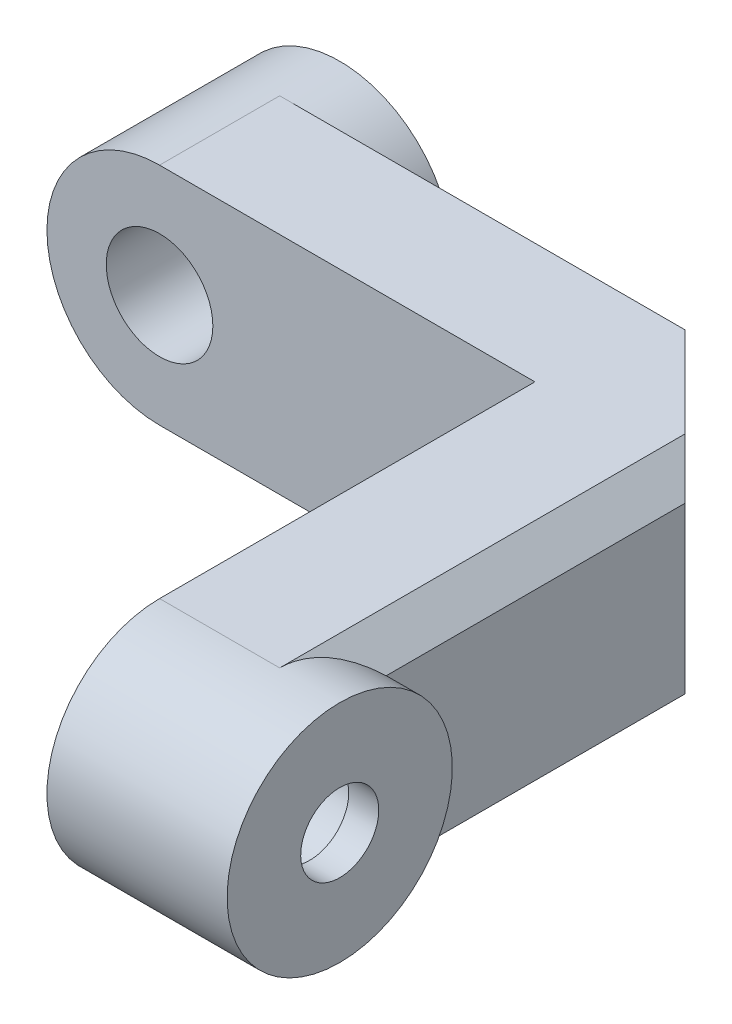
ISO-10303-21;
HEADER;
FILE_DESCRIPTION(('STEP AP214'),'2;1');
FILE_NAME('part.step','',(''),(''),'','','');
FILE_SCHEMA(('AUTOMOTIVE_DESIGN { 1 0 10303 214 1 1 1 1 }'));
ENDSEC;
DATA;
#1=APPLICATION_CONTEXT('core data for automotive mechanical design processes');
#2=APPLICATION_PROTOCOL_DEFINITION('international standard','automotive_design',2000,#1);
#3=PRODUCT_CONTEXT('',#1,'mechanical');
#4=PRODUCT('Part','Part','',(#3));
#5=PRODUCT_RELATED_PRODUCT_CATEGORY('part','',(#4));
#6=PRODUCT_DEFINITION_FORMATION('','',#4);
#7=PRODUCT_DEFINITION_CONTEXT('part definition',#1,'design');
#8=PRODUCT_DEFINITION('design','',#6,#7);
#9=PRODUCT_DEFINITION_SHAPE('','',#8);
#10=(LENGTH_UNIT() NAMED_UNIT(*) SI_UNIT(.MILLI.,.METRE.));
#11=(NAMED_UNIT(*) PLANE_ANGLE_UNIT() SI_UNIT($,.RADIAN.));
#12=(NAMED_UNIT(*) SI_UNIT($,.STERADIAN.) SOLID_ANGLE_UNIT());
#13=UNCERTAINTY_MEASURE_WITH_UNIT(LENGTH_MEASURE(1.E-05),#10,'distance_accuracy_value','');
#14=(GEOMETRIC_REPRESENTATION_CONTEXT(3) GLOBAL_UNCERTAINTY_ASSIGNED_CONTEXT((#13)) GLOBAL_UNIT_ASSIGNED_CONTEXT((#10,
#11,#12)) REPRESENTATION_CONTEXT('',''));
#15=CARTESIAN_POINT('',(0.,0.,0.));
#16=DIRECTION('',(0.,0.,1.));
#17=DIRECTION('',(1.,0.,0.));
#18=AXIS2_PLACEMENT_3D('',#15,#16,#17);
#19=CARTESIAN_POINT('',(0.,0.,0.));
#20=DIRECTION('',(0.,0.,1.));
#21=DIRECTION('',(1.,0.,0.));
#22=AXIS2_PLACEMENT_3D('',#19,#20,#21);
#23=PLANE('',#22);
#24=DIRECTION('',(0.,-1.,0.));
#25=VECTOR('',#24,1.);
#26=CARTESIAN_POINT('',(25.,0.,0.));
#27=LINE('',#26,#25);
#28=CARTESIAN_POINT('',(25.,5.5,0.));
#29=VERTEX_POINT('',#28);
#30=CARTESIAN_POINT('',(25.,-5.5,0.));
#31=VERTEX_POINT('',#30);
#32=EDGE_CURVE('E205',#29,#31,#27,.T.);
#33=ORIENTED_EDGE('',*,*,#32,.T.);
#34=DIRECTION('',(-1.,0.,0.));
#35=VECTOR('',#34,1.);
#36=CARTESIAN_POINT('',(0.,-5.5,0.));
#37=LINE('',#36,#35);
#38=CARTESIAN_POINT('',(5.09901951359279,-5.5,0.));
#39=VERTEX_POINT('',#38);
#40=EDGE_CURVE('E59',#31,#39,#37,.T.);
#41=ORIENTED_EDGE('',*,*,#40,.T.);
#42=CARTESIAN_POINT('',(0.,0.,0.));
#43=DIRECTION('',(0.,0.,-1.));
#44=DIRECTION('',(-1.,0.,0.));
#45=AXIS2_PLACEMENT_3D('',#42,#43,#44);
#46=CIRCLE('',#45,7.5);
#47=CARTESIAN_POINT('',(5.09901951359279,5.5,0.));
#48=VERTEX_POINT('',#47);
#49=EDGE_CURVE('E259',#48,#39,#46,.T.);
#50=ORIENTED_EDGE('',*,*,#49,.F.);
#51=DIRECTION('',(1.,0.,0.));
#52=VECTOR('',#51,1.);
#53=CARTESIAN_POINT('',(25.,5.5,0.));
#54=LINE('',#53,#52);
#55=EDGE_CURVE('E245',#48,#29,#54,.T.);
#56=ORIENTED_EDGE('',*,*,#55,.T.);
#57=EDGE_LOOP('',(#33,#41,#50,#56));
#58=FACE_BOUND('',#57,.T.);
#59=ADVANCED_FACE('F42',(#58),#23,.F.);
#60=CARTESIAN_POINT('',(35.,-7.5,50.));
#61=DIRECTION('',(0.,-1.,0.));
#62=DIRECTION('',(1.,0.,0.));
#63=AXIS2_PLACEMENT_3D('',#60,#61,#62);
#64=PLANE('',#63);
#65=DIRECTION('',(-0.707106781186548,0.,-0.707106781186547));
#66=VECTOR('',#65,1.);
#67=CARTESIAN_POINT('',(55.,-7.5,30.));
#68=LINE('',#67,#66);
#69=CARTESIAN_POINT('',(27.,-7.5,1.99999999999999));
#70=VERTEX_POINT('',#69);
#71=CARTESIAN_POINT('',(33.,-7.5,8.00000000000001));
#72=VERTEX_POINT('',#71);
#73=EDGE_CURVE('E208',#70,#72,#68,.F.);
#74=ORIENTED_EDGE('',*,*,#73,.T.);
#75=DIRECTION('',(0.,0.,1.));
#76=VECTOR('',#75,1.);
#77=CARTESIAN_POINT('',(33.,-7.5,35.));
#78=LINE('',#77,#76);
#79=CARTESIAN_POINT('',(33.,-7.49999999999999,35.));
#80=VERTEX_POINT('',#79);
#81=EDGE_CURVE('E235',#72,#80,#78,.T.);
#82=ORIENTED_EDGE('',*,*,#81,.T.);
#83=DIRECTION('',(1.,0.,0.));
#84=VECTOR('',#83,1.);
#85=CARTESIAN_POINT('',(-7.5,-7.49999999999999,35.));
#86=LINE('',#85,#84);
#87=CARTESIAN_POINT('',(25.,-7.49999999999999,35.));
#88=VERTEX_POINT('',#87);
#89=EDGE_CURVE('E152',#88,#80,#86,.T.);
#90=ORIENTED_EDGE('',*,*,#89,.F.);
#91=DIRECTION('',(0.,0.,1.));
#92=VECTOR('',#91,1.);
#93=CARTESIAN_POINT('',(25.,-7.5,0.));
#94=LINE('',#93,#92);
#95=CARTESIAN_POINT('',(25.,-7.5,10.));
#96=VERTEX_POINT('',#95);
#97=EDGE_CURVE('E149',#96,#88,#94,.T.);
#98=ORIENTED_EDGE('',*,*,#97,.F.);
#99=DIRECTION('',(1.,0.,0.));
#100=VECTOR('',#99,1.);
#101=CARTESIAN_POINT('',(0.,-7.5,10.));
#102=LINE('',#101,#100);
#103=CARTESIAN_POINT('',(0.,-7.5,10.));
#104=VERTEX_POINT('',#103);
#105=EDGE_CURVE('E171',#104,#96,#102,.T.);
#106=ORIENTED_EDGE('',*,*,#105,.F.);
#107=DIRECTION('',(0.,0.,-1.));
#108=VECTOR('',#107,1.);
#109=CARTESIAN_POINT('',(0.,-7.5,50.));
#110=LINE('',#109,#108);
#111=CARTESIAN_POINT('',(0.,-7.5,1.99999999999999));
#112=VERTEX_POINT('',#111);
#113=EDGE_CURVE('E160',#104,#112,#110,.T.);
#114=ORIENTED_EDGE('',*,*,#113,.T.);
#115=DIRECTION('',(1.,0.,0.));
#116=VECTOR('',#115,1.);
#117=CARTESIAN_POINT('',(25.,-7.5,1.99999999999999));
#118=LINE('',#117,#116);
#119=EDGE_CURVE('E231',#112,#70,#118,.T.);
#120=ORIENTED_EDGE('',*,*,#119,.T.);
#121=EDGE_LOOP('',(#74,#82,#90,#98,#106,#114,#120));
#122=FACE_BOUND('',#121,.T.);
#123=ADVANCED_FACE('F264',(#122),#64,.T.);
#124=CARTESIAN_POINT('',(0.,0.,10.));
#125=DIRECTION('',(0.,0.,1.));
#126=DIRECTION('',(1.,0.,0.));
#127=AXIS2_PLACEMENT_3D('',#124,#125,#126);
#128=PLANE('',#127);
#129=CARTESIAN_POINT('',(0.,0.,10.));
#130=DIRECTION('',(0.,0.,1.));
#131=DIRECTION('',(1.,0.,0.));
#132=AXIS2_PLACEMENT_3D('',#129,#130,#131);
#133=CIRCLE('',#132,3.55);
#134=CARTESIAN_POINT('',(3.55,0.,10.));
#135=VERTEX_POINT('',#134);
#136=EDGE_CURVE('E188',#135,#135,#133,.T.);
#137=ORIENTED_EDGE('',*,*,#136,.F.);
#138=EDGE_LOOP('',(#137));
#139=FACE_BOUND('',#138,.T.);
#140=CARTESIAN_POINT('',(0.,0.,10.));
#141=DIRECTION('',(0.,0.,1.));
#142=DIRECTION('',(1.,0.,0.));
#143=AXIS2_PLACEMENT_3D('',#140,#141,#142);
#144=CIRCLE('',#143,7.5);
#145=CARTESIAN_POINT('',(0.,7.5,10.));
#146=VERTEX_POINT('',#145);
#147=EDGE_CURVE('E175',#146,#104,#144,.T.);
#148=ORIENTED_EDGE('',*,*,#147,.T.);
#149=ORIENTED_EDGE('',*,*,#105,.T.);
#150=DIRECTION('',(0.,1.,0.));
#151=VECTOR('',#150,1.);
#152=CARTESIAN_POINT('',(25.,20.,10.));
#153=LINE('',#152,#151);
#154=CARTESIAN_POINT('',(25.,7.5,10.));
#155=VERTEX_POINT('',#154);
#156=EDGE_CURVE('E141',#96,#155,#153,.T.);
#157=ORIENTED_EDGE('',*,*,#156,.T.);
#158=DIRECTION('',(-1.,0.,0.));
#159=VECTOR('',#158,1.);
#160=CARTESIAN_POINT('',(0.,7.5,10.));
#161=LINE('',#160,#159);
#162=EDGE_CURVE('E157',#155,#146,#161,.T.);
#163=ORIENTED_EDGE('',*,*,#162,.T.);
#164=EDGE_LOOP('',(#148,#149,#157,#163));
#165=FACE_BOUND('',#164,.T.);
#166=ADVANCED_FACE('F339',(#139,#165),#128,.T.);
#167=CARTESIAN_POINT('',(25.,0.,0.));
#168=DIRECTION('',(-1.,0.,0.));
#169=DIRECTION('',(0.,-1.,0.));
#170=AXIS2_PLACEMENT_3D('',#167,#168,#169);
#171=PLANE('',#170);
#172=CARTESIAN_POINT('',(25.,0.,35.));
#173=DIRECTION('',(1.,0.,0.));
#174=DIRECTION('',(0.,1.,0.));
#175=AXIS2_PLACEMENT_3D('',#172,#173,#174);
#176=CIRCLE('',#175,3.55);
#177=CARTESIAN_POINT('',(25.,3.55,35.));
#178=VERTEX_POINT('',#177);
#179=EDGE_CURVE('E178',#178,#178,#176,.T.);
#180=ORIENTED_EDGE('',*,*,#179,.T.);
#181=EDGE_LOOP('',(#180));
#182=FACE_BOUND('',#181,.T.);
#183=ORIENTED_EDGE('',*,*,#97,.T.);
#184=CARTESIAN_POINT('',(25.,0.,35.));
#185=DIRECTION('',(-1.,0.,0.));
#186=DIRECTION('',(0.,-1.,0.));
#187=AXIS2_PLACEMENT_3D('',#184,#185,#186);
#188=CIRCLE('',#187,7.49999999999999);
#189=CARTESIAN_POINT('',(25.,7.5,35.));
#190=VERTEX_POINT('',#189);
#191=EDGE_CURVE('E130',#88,#190,#188,.T.);
#192=ORIENTED_EDGE('',*,*,#191,.T.);
#193=DIRECTION('',(0.,0.,-1.));
#194=VECTOR('',#193,1.);
#195=CARTESIAN_POINT('',(25.,7.5,0.));
#196=LINE('',#195,#194);
#197=EDGE_CURVE('E147',#190,#155,#196,.T.);
#198=ORIENTED_EDGE('',*,*,#197,.T.);
#199=ORIENTED_EDGE('',*,*,#156,.F.);
#200=EDGE_LOOP('',(#183,#192,#198,#199));
#201=FACE_BOUND('',#200,.T.);
#202=ADVANCED_FACE('F145',(#182,#201),#171,.T.);
#203=CARTESIAN_POINT('',(35.,0.,0.));
#204=DIRECTION('',(-1.,0.,0.));
#205=DIRECTION('',(0.,-1.,0.));
#206=AXIS2_PLACEMENT_3D('',#203,#204,#205);
#207=PLANE('',#206);
#208=CARTESIAN_POINT('',(35.,0.,35.));
#209=DIRECTION('',(1.,0.,0.));
#210=DIRECTION('',(0.,1.,0.));
#211=AXIS2_PLACEMENT_3D('',#208,#209,#210);
#212=CIRCLE('',#211,7.49999999999999);
#213=CARTESIAN_POINT('',(35.,-5.50000000000001,29.9009804864072));
#214=VERTEX_POINT('',#213);
#215=CARTESIAN_POINT('',(35.,5.5,29.9009804864072));
#216=VERTEX_POINT('',#215);
#217=EDGE_CURVE('E140',#214,#216,#212,.T.);
#218=ORIENTED_EDGE('',*,*,#217,.F.);
#219=DIRECTION('',(0.,0.,-1.));
#220=VECTOR('',#219,1.);
#221=CARTESIAN_POINT('',(35.,-5.50000000000001,10.));
#222=LINE('',#221,#220);
#223=CARTESIAN_POINT('',(35.,-5.50000000000001,10.));
#224=VERTEX_POINT('',#223);
#225=EDGE_CURVE('E215',#214,#224,#222,.T.);
#226=ORIENTED_EDGE('',*,*,#225,.T.);
#227=DIRECTION('',(0.,1.,0.));
#228=VECTOR('',#227,1.);
#229=CARTESIAN_POINT('',(35.,0.,10.));
#230=LINE('',#229,#228);
#231=CARTESIAN_POINT('',(35.,5.5,10.));
#232=VERTEX_POINT('',#231);
#233=EDGE_CURVE('E197',#224,#232,#230,.T.);
#234=ORIENTED_EDGE('',*,*,#233,.T.);
#235=DIRECTION('',(0.,0.,1.));
#236=VECTOR('',#235,1.);
#237=CARTESIAN_POINT('',(35.,5.5,35.));
#238=LINE('',#237,#236);
#239=EDGE_CURVE('E212',#232,#216,#238,.T.);
#240=ORIENTED_EDGE('',*,*,#239,.T.);
#241=EDGE_LOOP('',(#218,#226,#234,#240));
#242=FACE_BOUND('',#241,.T.);
#243=ADVANCED_FACE('F281',(#242),#207,.F.);
#244=CARTESIAN_POINT('',(0.,0.,10.));
#245=DIRECTION('',(0.,0.,-1.));
#246=DIRECTION('',(-1.,0.,0.));
#247=AXIS2_PLACEMENT_3D('',#244,#245,#246);
#248=CYLINDRICAL_SURFACE('',#247,3.55);
#249=ORIENTED_EDGE('',*,*,#136,.T.);
#250=EDGE_LOOP('',(#249));
#251=FACE_BOUND('',#250,.T.);
#252=CARTESIAN_POINT('',(0.,0.,0.));
#253=DIRECTION('',(0.,0.,1.));
#254=DIRECTION('',(1.,0.,0.));
#255=AXIS2_PLACEMENT_3D('',#252,#253,#254);
#256=CIRCLE('',#255,3.55);
#257=CARTESIAN_POINT('',(3.55,0.,0.));
#258=VERTEX_POINT('',#257);
#259=EDGE_CURVE('E187',#258,#258,#256,.T.);
#260=ORIENTED_EDGE('',*,*,#259,.F.);
#261=EDGE_LOOP('',(#260));
#262=FACE_BOUND('',#261,.T.);
#263=ADVANCED_FACE('F433',(#251,#262),#248,.F.);
#264=CARTESIAN_POINT('',(35.,0.,35.));
#265=DIRECTION('',(-1.,0.,0.));
#266=DIRECTION('',(0.,-1.,0.));
#267=AXIS2_PLACEMENT_3D('',#264,#265,#266);
#268=CYLINDRICAL_SURFACE('',#267,3.55);
#269=CARTESIAN_POINT('',(35.,0.,35.));
#270=DIRECTION('',(1.,0.,0.));
#271=DIRECTION('',(0.,1.,0.));
#272=AXIS2_PLACEMENT_3D('',#269,#270,#271);
#273=CIRCLE('',#272,3.55);
#274=CARTESIAN_POINT('',(35.,3.55,35.));
#275=VERTEX_POINT('',#274);
#276=EDGE_CURVE('E179',#275,#275,#273,.T.);
#277=ORIENTED_EDGE('',*,*,#276,.T.);
#278=EDGE_LOOP('',(#277));
#279=FACE_BOUND('',#278,.T.);
#280=ORIENTED_EDGE('',*,*,#179,.F.);
#281=EDGE_LOOP('',(#280));
#282=FACE_BOUND('',#281,.T.);
#283=ADVANCED_FACE('F421',(#279,#282),#268,.F.);
#284=CARTESIAN_POINT('',(0.,0.,50.));
#285=DIRECTION('',(0.,0.,-1.));
#286=DIRECTION('',(-1.,0.,0.));
#287=AXIS2_PLACEMENT_3D('',#284,#285,#286);
#288=CYLINDRICAL_SURFACE('',#287,7.5);
#289=DIRECTION('',(0.,0.,-1.));
#290=VECTOR('',#289,1.);
#291=CARTESIAN_POINT('',(0.,7.5,50.));
#292=LINE('',#291,#290);
#293=CARTESIAN_POINT('',(0.,7.5,1.99999999999999));
#294=VERTEX_POINT('',#293);
#295=EDGE_CURVE('E151',#146,#294,#292,.T.);
#296=ORIENTED_EDGE('',*,*,#295,.T.);
#297=CARTESIAN_POINT('',(0.,0.,-5.49999999999996));
#298=DIRECTION('',(0.,0.707106781186545,-0.70710678118655));
#299=DIRECTION('',(0.,-0.70710678118655,-0.707106781186545));
#300=AXIS2_PLACEMENT_3D('',#297,#298,#299);
#301=ELLIPSE('',#300,10.6066017177982,7.5);
#302=EDGE_CURVE('E12',#294,#48,#301,.T.);
#303=ORIENTED_EDGE('',*,*,#302,.T.);
#304=ORIENTED_EDGE('',*,*,#49,.T.);
#305=CARTESIAN_POINT('',(0.,0.,-5.49999999999996));
#306=DIRECTION('',(0.,-0.707106781186545,-0.70710678118655));
#307=DIRECTION('',(0.,0.70710678118655,-0.707106781186545));
#308=AXIS2_PLACEMENT_3D('',#305,#306,#307);
#309=ELLIPSE('',#308,10.6066017177982,7.5);
#310=EDGE_CURVE('E52',#39,#112,#309,.T.);
#311=ORIENTED_EDGE('',*,*,#310,.T.);
#312=ORIENTED_EDGE('',*,*,#113,.F.);
#313=ORIENTED_EDGE('',*,*,#147,.F.);
#314=EDGE_LOOP('',(#296,#303,#304,#311,#312,#313));
#315=FACE_BOUND('',#314,.T.);
#316=CARTESIAN_POINT('',(0.,0.,-2.));
#317=DIRECTION('',(0.,0.,-1.));
#318=DIRECTION('',(-1.,0.,0.));
#319=AXIS2_PLACEMENT_3D('',#316,#317,#318);
#320=CIRCLE('',#319,7.5);
#321=CARTESIAN_POINT('',(-7.5,0.,-2.));
#322=VERTEX_POINT('',#321);
#323=EDGE_CURVE('E300',#322,#322,#320,.T.);
#324=ORIENTED_EDGE('',*,*,#323,.F.);
#325=EDGE_LOOP('',(#324));
#326=FACE_BOUND('',#325,.T.);
#327=ADVANCED_FACE('F257',(#315,#326),#288,.T.);
#328=CARTESIAN_POINT('',(0.,7.5,50.));
#329=DIRECTION('',(0.,1.,0.));
#330=DIRECTION('',(-1.,0.,0.));
#331=AXIS2_PLACEMENT_3D('',#328,#329,#330);
#332=PLANE('',#331);
#333=DIRECTION('',(1.,0.,0.));
#334=VECTOR('',#333,1.);
#335=CARTESIAN_POINT('',(-7.5,7.49999999999999,35.));
#336=LINE('',#335,#334);
#337=CARTESIAN_POINT('',(33.,7.5,35.));
#338=VERTEX_POINT('',#337);
#339=EDGE_CURVE('E125',#190,#338,#336,.T.);
#340=ORIENTED_EDGE('',*,*,#339,.T.);
#341=DIRECTION('',(0.,0.,-1.));
#342=VECTOR('',#341,1.);
#343=CARTESIAN_POINT('',(33.,7.5,10.));
#344=LINE('',#343,#342);
#345=CARTESIAN_POINT('',(33.,7.5,8.00000000000002));
#346=VERTEX_POINT('',#345);
#347=EDGE_CURVE('E242',#338,#346,#344,.T.);
#348=ORIENTED_EDGE('',*,*,#347,.T.);
#349=DIRECTION('',(0.707106781186548,0.,0.707106781186547));
#350=VECTOR('',#349,1.);
#351=CARTESIAN_POINT('',(37.5,7.5,12.4999999999999));
#352=LINE('',#351,#350);
#353=CARTESIAN_POINT('',(27.,7.5,1.99999999999999));
#354=VERTEX_POINT('',#353);
#355=EDGE_CURVE('E201',#346,#354,#352,.F.);
#356=ORIENTED_EDGE('',*,*,#355,.T.);
#357=DIRECTION('',(-1.,0.,0.));
#358=VECTOR('',#357,1.);
#359=CARTESIAN_POINT('',(0.,7.5,1.99999999999999));
#360=LINE('',#359,#358);
#361=EDGE_CURVE('E238',#354,#294,#360,.T.);
#362=ORIENTED_EDGE('',*,*,#361,.T.);
#363=ORIENTED_EDGE('',*,*,#295,.F.);
#364=ORIENTED_EDGE('',*,*,#162,.F.);
#365=ORIENTED_EDGE('',*,*,#197,.F.);
#366=EDGE_LOOP('',(#340,#348,#356,#362,#363,#364,#365));
#367=FACE_BOUND('',#366,.T.);
#368=ADVANCED_FACE('F154',(#367),#332,.T.);
#369=CARTESIAN_POINT('',(-7.5,0.,35.));
#370=DIRECTION('',(1.,0.,0.));
#371=DIRECTION('',(0.,1.,0.));
#372=AXIS2_PLACEMENT_3D('',#369,#370,#371);
#373=CYLINDRICAL_SURFACE('',#372,7.49999999999999);
#374=ORIENTED_EDGE('',*,*,#191,.F.);
#375=ORIENTED_EDGE('',*,*,#89,.T.);
#376=CARTESIAN_POINT('',(40.5000000000001,0.,35.));
#377=DIRECTION('',(0.707106781186545,-0.70710678118655,0.));
#378=DIRECTION('',(0.70710678118655,0.707106781186545,0.));
#379=AXIS2_PLACEMENT_3D('',#376,#377,#378);
#380=ELLIPSE('',#379,10.6066017177982,7.49999999999999);
#381=EDGE_CURVE('E250',#80,#214,#380,.T.);
#382=ORIENTED_EDGE('',*,*,#381,.T.);
#383=ORIENTED_EDGE('',*,*,#217,.T.);
#384=CARTESIAN_POINT('',(40.5,0.,35.));
#385=DIRECTION('',(0.70710678118655,0.707106781186545,0.));
#386=DIRECTION('',(0.707106781186545,-0.70710678118655,0.));
#387=AXIS2_PLACEMENT_3D('',#384,#385,#386);
#388=ELLIPSE('',#387,10.6066017177982,7.49999999999999);
#389=EDGE_CURVE('E134',#216,#338,#388,.T.);
#390=ORIENTED_EDGE('',*,*,#389,.T.);
#391=ORIENTED_EDGE('',*,*,#339,.F.);
#392=EDGE_LOOP('',(#374,#375,#382,#383,#390,#391));
#393=FACE_BOUND('',#392,.T.);
#394=CARTESIAN_POINT('',(37.,0.,35.));
#395=DIRECTION('',(1.,0.,0.));
#396=DIRECTION('',(0.,1.,0.));
#397=AXIS2_PLACEMENT_3D('',#394,#395,#396);
#398=CIRCLE('',#397,7.49999999999999);
#399=CARTESIAN_POINT('',(37.,7.5,35.));
#400=VERTEX_POINT('',#399);
#401=EDGE_CURVE('E183',#400,#400,#398,.T.);
#402=ORIENTED_EDGE('',*,*,#401,.F.);
#403=EDGE_LOOP('',(#402));
#404=FACE_BOUND('',#403,.T.);
#405=ADVANCED_FACE('F127',(#393,#404),#373,.T.);
#406=CARTESIAN_POINT('',(37.,0.,35.));
#407=DIRECTION('',(1.,0.,0.));
#408=DIRECTION('',(0.,1.,0.));
#409=AXIS2_PLACEMENT_3D('',#406,#407,#408);
#410=PLANE('',#409);
#411=ORIENTED_EDGE('',*,*,#401,.T.);
#412=EDGE_LOOP('',(#411));
#413=FACE_BOUND('',#412,.T.);
#414=CARTESIAN_POINT('',(37.,0.,35.));
#415=DIRECTION('',(1.,0.,0.));
#416=DIRECTION('',(0.,1.,0.));
#417=AXIS2_PLACEMENT_3D('',#414,#415,#416);
#418=CIRCLE('',#417,2.6);
#419=CARTESIAN_POINT('',(37.,2.6,35.));
#420=VERTEX_POINT('',#419);
#421=EDGE_CURVE('E295',#420,#420,#418,.T.);
#422=ORIENTED_EDGE('',*,*,#421,.F.);
#423=EDGE_LOOP('',(#422));
#424=FACE_BOUND('',#423,.T.);
#425=ADVANCED_FACE('F399',(#413,#424),#410,.T.);
#426=CARTESIAN_POINT('',(35.,0.,35.));
#427=DIRECTION('',(1.,0.,0.));
#428=DIRECTION('',(0.,1.,0.));
#429=AXIS2_PLACEMENT_3D('',#426,#427,#428);
#430=PLANE('',#429);
#431=ORIENTED_EDGE('',*,*,#276,.F.);
#432=EDGE_LOOP('',(#431));
#433=FACE_BOUND('',#432,.T.);
#434=CARTESIAN_POINT('',(35.,0.,35.));
#435=DIRECTION('',(1.,0.,0.));
#436=DIRECTION('',(0.,1.,0.));
#437=AXIS2_PLACEMENT_3D('',#434,#435,#436);
#438=CIRCLE('',#437,2.6);
#439=CARTESIAN_POINT('',(35.,2.6,35.));
#440=VERTEX_POINT('',#439);
#441=EDGE_CURVE('E296',#440,#440,#438,.T.);
#442=ORIENTED_EDGE('',*,*,#441,.T.);
#443=EDGE_LOOP('',(#442));
#444=FACE_BOUND('',#443,.T.);
#445=ADVANCED_FACE('F470',(#433,#444),#430,.F.);
#446=CARTESIAN_POINT('',(37.,0.,35.));
#447=DIRECTION('',(-1.,0.,0.));
#448=DIRECTION('',(0.,-1.,0.));
#449=AXIS2_PLACEMENT_3D('',#446,#447,#448);
#450=CYLINDRICAL_SURFACE('',#449,2.6);
#451=ORIENTED_EDGE('',*,*,#421,.T.);
#452=EDGE_LOOP('',(#451));
#453=FACE_BOUND('',#452,.T.);
#454=ORIENTED_EDGE('',*,*,#441,.F.);
#455=EDGE_LOOP('',(#454));
#456=FACE_BOUND('',#455,.T.);
#457=ADVANCED_FACE('F331',(#453,#456),#450,.F.);
#458=CARTESIAN_POINT('',(0.,0.,0.));
#459=DIRECTION('',(0.,0.,-1.));
#460=DIRECTION('',(-1.,0.,0.));
#461=AXIS2_PLACEMENT_3D('',#458,#459,#460);
#462=PLANE('',#461);
#463=CARTESIAN_POINT('',(0.,0.,0.));
#464=DIRECTION('',(0.,0.,-1.));
#465=DIRECTION('',(-1.,0.,0.));
#466=AXIS2_PLACEMENT_3D('',#463,#464,#465);
#467=CIRCLE('',#466,2.6);
#468=CARTESIAN_POINT('',(-2.6,0.,0.));
#469=VERTEX_POINT('',#468);
#470=EDGE_CURVE('E310',#469,#469,#467,.T.);
#471=ORIENTED_EDGE('',*,*,#470,.T.);
#472=EDGE_LOOP('',(#471));
#473=FACE_BOUND('',#472,.T.);
#474=ORIENTED_EDGE('',*,*,#259,.T.);
#475=EDGE_LOOP('',(#474));
#476=FACE_BOUND('',#475,.T.);
#477=ADVANCED_FACE('F323',(#473,#476),#462,.F.);
#478=CARTESIAN_POINT('',(0.,0.,-2.));
#479=DIRECTION('',(0.,0.,-1.));
#480=DIRECTION('',(-1.,0.,0.));
#481=AXIS2_PLACEMENT_3D('',#478,#479,#480);
#482=PLANE('',#481);
#483=ORIENTED_EDGE('',*,*,#323,.T.);
#484=EDGE_LOOP('',(#483));
#485=FACE_BOUND('',#484,.T.);
#486=CARTESIAN_POINT('',(0.,0.,-2.));
#487=DIRECTION('',(0.,0.,-1.));
#488=DIRECTION('',(-1.,0.,0.));
#489=AXIS2_PLACEMENT_3D('',#486,#487,#488);
#490=CIRCLE('',#489,2.6);
#491=CARTESIAN_POINT('',(-2.6,0.,-2.));
#492=VERTEX_POINT('',#491);
#493=EDGE_CURVE('E306',#492,#492,#490,.T.);
#494=ORIENTED_EDGE('',*,*,#493,.F.);
#495=EDGE_LOOP('',(#494));
#496=FACE_BOUND('',#495,.T.);
#497=ADVANCED_FACE('F321',(#485,#496),#482,.T.);
#498=CARTESIAN_POINT('',(0.,0.,-2.));
#499=DIRECTION('',(0.,0.,1.));
#500=DIRECTION('',(1.,0.,0.));
#501=AXIS2_PLACEMENT_3D('',#498,#499,#500);
#502=CYLINDRICAL_SURFACE('',#501,2.6);
#503=ORIENTED_EDGE('',*,*,#493,.T.);
#504=EDGE_LOOP('',(#503));
#505=FACE_BOUND('',#504,.T.);
#506=ORIENTED_EDGE('',*,*,#470,.F.);
#507=EDGE_LOOP('',(#506));
#508=FACE_BOUND('',#507,.T.);
#509=ADVANCED_FACE('F318',(#505,#508),#502,.F.);
#510=CARTESIAN_POINT('',(35.,0.,10.));
#511=DIRECTION('',(-0.707106781186547,0.,0.707106781186548));
#512=DIRECTION('',(0.,1.,0.));
#513=AXIS2_PLACEMENT_3D('',#510,#511,#512);
#514=PLANE('',#513);
#515=ORIENTED_EDGE('',*,*,#233,.F.);
#516=DIRECTION('',(0.577350269189628,0.577350269189624,0.577350269189626));
#517=VECTOR('',#516,1.);
#518=CARTESIAN_POINT('',(36.8333333333333,-3.66666666666669,11.8333333333333));
#519=LINE('',#518,#517);
#520=EDGE_CURVE('E228',#224,#72,#519,.F.);
#521=ORIENTED_EDGE('',*,*,#520,.T.);
#522=ORIENTED_EDGE('',*,*,#73,.F.);
#523=DIRECTION('',(0.577350269189626,-0.577350269189628,0.577350269189624));
#524=VECTOR('',#523,1.);
#525=CARTESIAN_POINT('',(29.8333333333333,-10.3333333333333,4.83333333333331));
#526=LINE('',#525,#524);
#527=EDGE_CURVE('E222',#70,#31,#526,.F.);
#528=ORIENTED_EDGE('',*,*,#527,.T.);
#529=ORIENTED_EDGE('',*,*,#32,.F.);
#530=DIRECTION('',(-0.577350269189625,-0.577350269189628,-0.577350269189624));
#531=VECTOR('',#530,1.);
#532=CARTESIAN_POINT('',(29.8333333333333,10.3333333333333,4.83333333333331));
#533=LINE('',#532,#531);
#534=EDGE_CURVE('E219',#29,#354,#533,.F.);
#535=ORIENTED_EDGE('',*,*,#534,.T.);
#536=ORIENTED_EDGE('',*,*,#355,.F.);
#537=DIRECTION('',(-0.577350269189625,0.577350269189629,-0.577350269189623));
#538=VECTOR('',#537,1.);
#539=CARTESIAN_POINT('',(36.8333333333333,3.66666666666665,11.8333333333333));
#540=LINE('',#539,#538);
#541=EDGE_CURVE('E225',#346,#232,#540,.F.);
#542=ORIENTED_EDGE('',*,*,#541,.T.);
#543=EDGE_LOOP('',(#515,#521,#522,#528,#529,#535,#536,#542));
#544=FACE_BOUND('',#543,.T.);
#545=ADVANCED_FACE('F270',(#544),#514,.F.);
#546=CARTESIAN_POINT('',(35.,-5.50000000000001,0.));
#547=DIRECTION('',(0.707106781186545,-0.70710678118655,0.));
#548=DIRECTION('',(0.,0.,1.));
#549=AXIS2_PLACEMENT_3D('',#546,#547,#548);
#550=PLANE('',#549);
#551=ORIENTED_EDGE('',*,*,#381,.F.);
#552=ORIENTED_EDGE('',*,*,#81,.F.);
#553=ORIENTED_EDGE('',*,*,#520,.F.);
#554=ORIENTED_EDGE('',*,*,#225,.F.);
#555=EDGE_LOOP('',(#551,#552,#553,#554));
#556=FACE_BOUND('',#555,.T.);
#557=ADVANCED_FACE('F285',(#556),#550,.T.);
#558=CARTESIAN_POINT('',(33.,7.5,50.));
#559=DIRECTION('',(0.70710678118655,0.707106781186545,0.));
#560=DIRECTION('',(0.,0.,1.));
#561=AXIS2_PLACEMENT_3D('',#558,#559,#560);
#562=PLANE('',#561);
#563=ORIENTED_EDGE('',*,*,#389,.F.);
#564=ORIENTED_EDGE('',*,*,#239,.F.);
#565=ORIENTED_EDGE('',*,*,#541,.F.);
#566=ORIENTED_EDGE('',*,*,#347,.F.);
#567=EDGE_LOOP('',(#563,#564,#565,#566));
#568=FACE_BOUND('',#567,.T.);
#569=ADVANCED_FACE('F277',(#568),#562,.T.);
#570=CARTESIAN_POINT('',(35.,-7.5,1.99999999999999));
#571=DIRECTION('',(0.,-0.707106781186545,-0.70710678118655));
#572=DIRECTION('',(-1.,0.,0.));
#573=AXIS2_PLACEMENT_3D('',#570,#571,#572);
#574=PLANE('',#573);
#575=ORIENTED_EDGE('',*,*,#310,.F.);
#576=ORIENTED_EDGE('',*,*,#40,.F.);
#577=ORIENTED_EDGE('',*,*,#527,.F.);
#578=ORIENTED_EDGE('',*,*,#119,.F.);
#579=EDGE_LOOP('',(#575,#576,#577,#578));
#580=FACE_BOUND('',#579,.T.);
#581=ADVANCED_FACE('F266',(#580),#574,.T.);
#582=CARTESIAN_POINT('',(0.,7.5,1.99999999999999));
#583=DIRECTION('',(0.,0.707106781186545,-0.70710678118655));
#584=DIRECTION('',(1.,0.,0.));
#585=AXIS2_PLACEMENT_3D('',#582,#583,#584);
#586=PLANE('',#585);
#587=ORIENTED_EDGE('',*,*,#534,.F.);
#588=ORIENTED_EDGE('',*,*,#55,.F.);
#589=ORIENTED_EDGE('',*,*,#302,.F.);
#590=ORIENTED_EDGE('',*,*,#361,.F.);
#591=EDGE_LOOP('',(#587,#588,#589,#590));
#592=FACE_BOUND('',#591,.T.);
#593=ADVANCED_FACE('F45',(#592),#586,.T.);
#594=CLOSED_SHELL('',(#59,#123,#166,#202,#243,#263,#283,#327,#368,#405,#425,#445,#457,#477,#497,
#509,#545,#557,#569,#581,#593));
#595=MANIFOLD_SOLID_BREP('B2',#594);
#596=ADVANCED_BREP_SHAPE_REPRESENTATION('',(#18,#595),#14);
#597=SHAPE_DEFINITION_REPRESENTATION(#9,#596);
ENDSEC;
END-ISO-10303-21;
